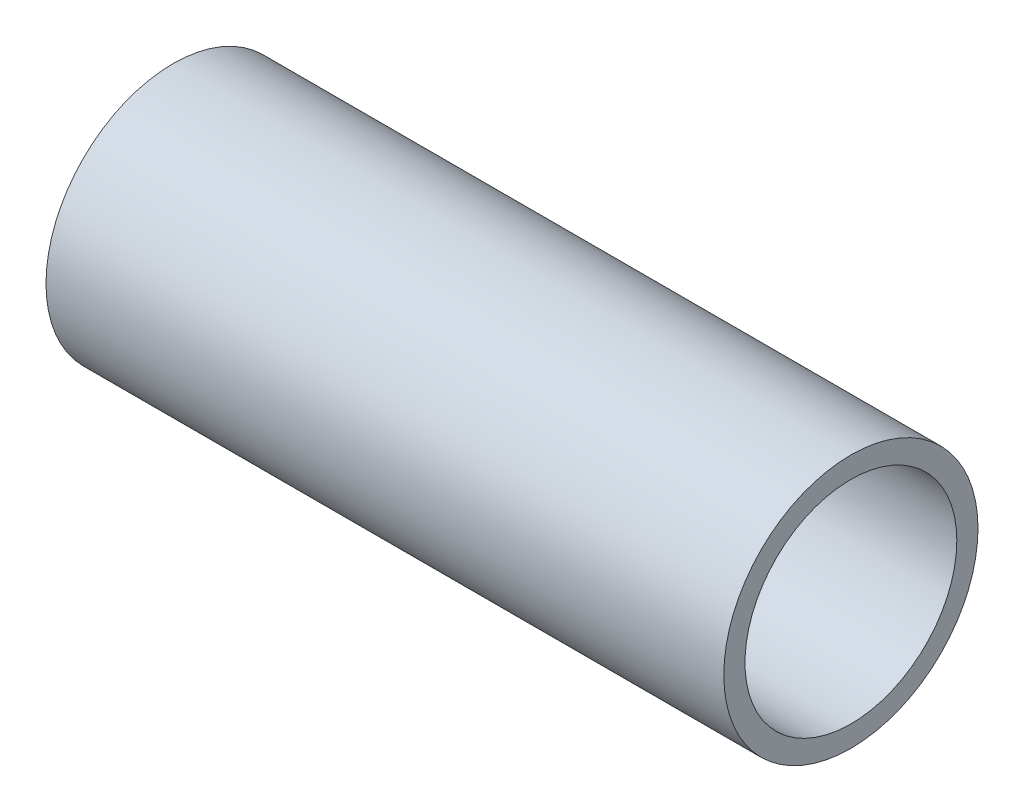
ISO-10303-21;
HEADER;
FILE_DESCRIPTION(('STEP AP214'),'2;1');
FILE_NAME('part.step','',(''),(''),'','','');
FILE_SCHEMA(('AUTOMOTIVE_DESIGN { 1 0 10303 214 1 1 1 1 }'));
ENDSEC;
DATA;
#1=APPLICATION_CONTEXT('core data for automotive mechanical design processes');
#2=APPLICATION_PROTOCOL_DEFINITION('international standard','automotive_design',2000,#1);
#3=PRODUCT_CONTEXT('',#1,'mechanical');
#4=PRODUCT('Part','Part','',(#3));
#5=PRODUCT_RELATED_PRODUCT_CATEGORY('part','',(#4));
#6=PRODUCT_DEFINITION_FORMATION('','',#4);
#7=PRODUCT_DEFINITION_CONTEXT('part definition',#1,'design');
#8=PRODUCT_DEFINITION('design','',#6,#7);
#9=PRODUCT_DEFINITION_SHAPE('','',#8);
#10=(LENGTH_UNIT() NAMED_UNIT(*) SI_UNIT(.MILLI.,.METRE.));
#11=(NAMED_UNIT(*) PLANE_ANGLE_UNIT() SI_UNIT($,.RADIAN.));
#12=(NAMED_UNIT(*) SI_UNIT($,.STERADIAN.) SOLID_ANGLE_UNIT());
#13=UNCERTAINTY_MEASURE_WITH_UNIT(LENGTH_MEASURE(1.E-05),#10,'distance_accuracy_value','');
#14=(GEOMETRIC_REPRESENTATION_CONTEXT(3) GLOBAL_UNCERTAINTY_ASSIGNED_CONTEXT((#13)) GLOBAL_UNIT_ASSIGNED_CONTEXT((#10,
#11,#12)) REPRESENTATION_CONTEXT('',''));
#15=CARTESIAN_POINT('',(0.,0.,0.));
#16=DIRECTION('',(0.,0.,1.));
#17=DIRECTION('',(1.,0.,0.));
#18=AXIS2_PLACEMENT_3D('',#15,#16,#17);
#19=CARTESIAN_POINT('',(32.,0.,0.));
#20=DIRECTION('',(1.,0.,0.));
#21=DIRECTION('',(0.,0.,-1.));
#22=AXIS2_PLACEMENT_3D('',#19,#20,#21);
#23=PLANE('',#22);
#24=CARTESIAN_POINT('',(32.,0.,0.));
#25=DIRECTION('',(1.,0.,0.));
#26=DIRECTION('',(0.,0.,-1.));
#27=AXIS2_PLACEMENT_3D('',#24,#25,#26);
#28=CIRCLE('',#27,6.);
#29=CARTESIAN_POINT('',(32.,0.,-6.));
#30=VERTEX_POINT('',#29);
#31=EDGE_CURVE('E10',#30,#30,#28,.T.);
#32=ORIENTED_EDGE('',*,*,#31,.T.);
#33=EDGE_LOOP('',(#32));
#34=FACE_BOUND('',#33,.T.);
#35=CARTESIAN_POINT('',(32.,0.,0.));
#36=DIRECTION('',(1.,0.,0.));
#37=DIRECTION('',(0.,0.,-1.));
#38=AXIS2_PLACEMENT_3D('',#35,#36,#37);
#39=CIRCLE('',#38,5.);
#40=CARTESIAN_POINT('',(32.,0.,-5.));
#41=VERTEX_POINT('',#40);
#42=EDGE_CURVE('E41',#41,#41,#39,.T.);
#43=ORIENTED_EDGE('',*,*,#42,.F.);
#44=EDGE_LOOP('',(#43));
#45=FACE_BOUND('',#44,.T.);
#46=ADVANCED_FACE('F30',(#34,#45),#23,.T.);
#47=CARTESIAN_POINT('',(0.,0.,0.));
#48=DIRECTION('',(1.,0.,0.));
#49=DIRECTION('',(0.,0.,-1.));
#50=AXIS2_PLACEMENT_3D('',#47,#48,#49);
#51=PLANE('',#50);
#52=CARTESIAN_POINT('',(0.,0.,0.));
#53=DIRECTION('',(1.,0.,0.));
#54=DIRECTION('',(0.,0.,-1.));
#55=AXIS2_PLACEMENT_3D('',#52,#53,#54);
#56=CIRCLE('',#55,6.);
#57=CARTESIAN_POINT('',(0.,0.,-6.));
#58=VERTEX_POINT('',#57);
#59=EDGE_CURVE('E34',#58,#58,#56,.T.);
#60=ORIENTED_EDGE('',*,*,#59,.F.);
#61=EDGE_LOOP('',(#60));
#62=FACE_BOUND('',#61,.T.);
#63=CARTESIAN_POINT('',(0.,0.,0.));
#64=DIRECTION('',(1.,0.,0.));
#65=DIRECTION('',(0.,0.,-1.));
#66=AXIS2_PLACEMENT_3D('',#63,#64,#65);
#67=CIRCLE('',#66,5.);
#68=CARTESIAN_POINT('',(0.,0.,-5.));
#69=VERTEX_POINT('',#68);
#70=EDGE_CURVE('E43',#69,#69,#67,.T.);
#71=ORIENTED_EDGE('',*,*,#70,.T.);
#72=EDGE_LOOP('',(#71));
#73=FACE_BOUND('',#72,.T.);
#74=ADVANCED_FACE('F53',(#62,#73),#51,.F.);
#75=CARTESIAN_POINT('',(32.,0.,0.));
#76=DIRECTION('',(-1.,0.,0.));
#77=DIRECTION('',(0.,0.,1.));
#78=AXIS2_PLACEMENT_3D('',#75,#76,#77);
#79=CYLINDRICAL_SURFACE('',#78,6.);
#80=ORIENTED_EDGE('',*,*,#31,.F.);
#81=EDGE_LOOP('',(#80));
#82=FACE_BOUND('',#81,.T.);
#83=ORIENTED_EDGE('',*,*,#59,.T.);
#84=EDGE_LOOP('',(#83));
#85=FACE_BOUND('',#84,.T.);
#86=ADVANCED_FACE('F32',(#82,#85),#79,.T.);
#87=CARTESIAN_POINT('',(32.,0.,0.));
#88=DIRECTION('',(-1.,0.,0.));
#89=DIRECTION('',(0.,0.,1.));
#90=AXIS2_PLACEMENT_3D('',#87,#88,#89);
#91=CYLINDRICAL_SURFACE('',#90,5.);
#92=ORIENTED_EDGE('',*,*,#42,.T.);
#93=EDGE_LOOP('',(#92));
#94=FACE_BOUND('',#93,.T.);
#95=ORIENTED_EDGE('',*,*,#70,.F.);
#96=EDGE_LOOP('',(#95));
#97=FACE_BOUND('',#96,.T.);
#98=ADVANCED_FACE('F49',(#94,#97),#91,.F.);
#99=CLOSED_SHELL('',(#46,#74,#86,#98));
#100=MANIFOLD_SOLID_BREP('B2',#99);
#101=ADVANCED_BREP_SHAPE_REPRESENTATION('',(#18,#100),#14);
#102=SHAPE_DEFINITION_REPRESENTATION(#9,#101);
ENDSEC;
END-ISO-10303-21;
